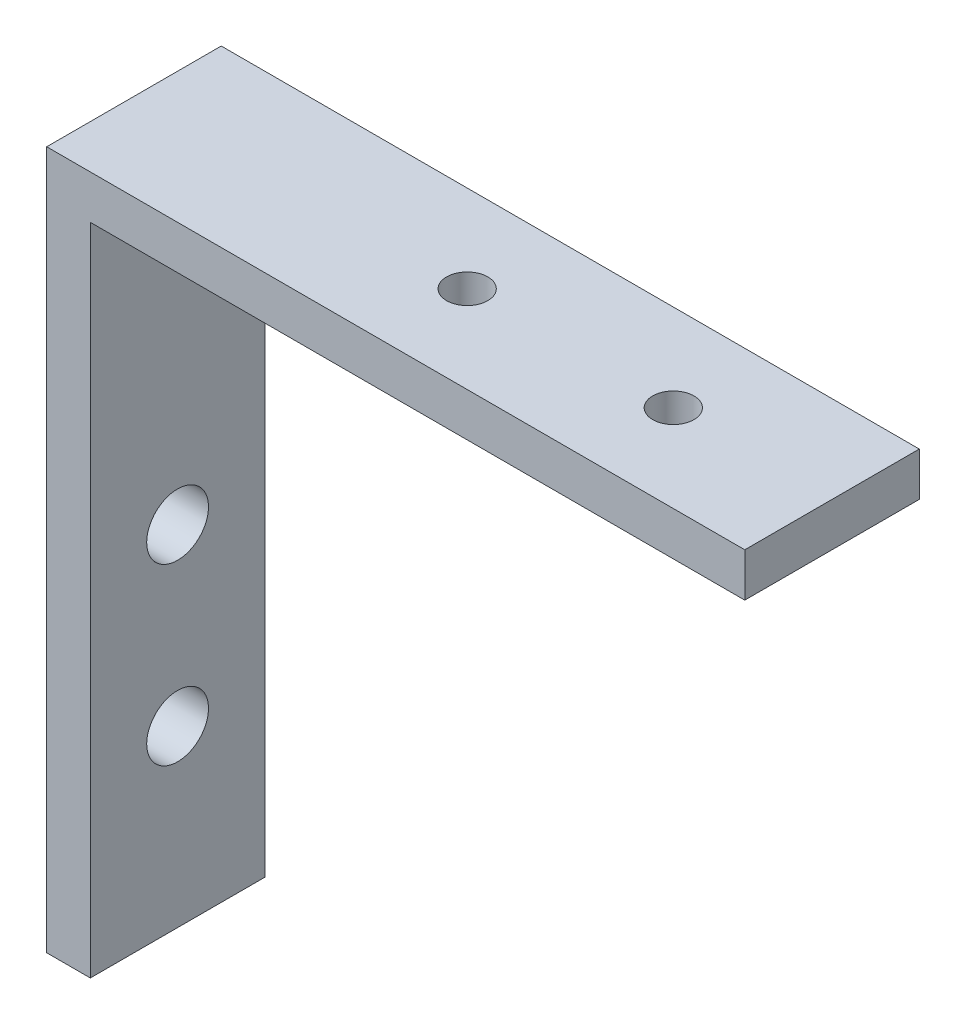
ISO-10303-21;
HEADER;
FILE_DESCRIPTION(('STEP AP214'),'2;1');
FILE_NAME('part.step','',(''),(''),'','','');
FILE_SCHEMA(('AUTOMOTIVE_DESIGN { 1 0 10303 214 1 1 1 1 }'));
ENDSEC;
DATA;
#1=APPLICATION_CONTEXT('core data for automotive mechanical design processes');
#2=APPLICATION_PROTOCOL_DEFINITION('international standard','automotive_design',2000,#1);
#3=PRODUCT_CONTEXT('',#1,'mechanical');
#4=PRODUCT('Part','Part','',(#3));
#5=PRODUCT_RELATED_PRODUCT_CATEGORY('part','',(#4));
#6=PRODUCT_DEFINITION_FORMATION('','',#4);
#7=PRODUCT_DEFINITION_CONTEXT('part definition',#1,'design');
#8=PRODUCT_DEFINITION('design','',#6,#7);
#9=PRODUCT_DEFINITION_SHAPE('','',#8);
#10=(LENGTH_UNIT() NAMED_UNIT(*) SI_UNIT(.MILLI.,.METRE.));
#11=(NAMED_UNIT(*) PLANE_ANGLE_UNIT() SI_UNIT($,.RADIAN.));
#12=(NAMED_UNIT(*) SI_UNIT($,.STERADIAN.) SOLID_ANGLE_UNIT());
#13=UNCERTAINTY_MEASURE_WITH_UNIT(LENGTH_MEASURE(1.E-05),#10,'distance_accuracy_value','');
#14=(GEOMETRIC_REPRESENTATION_CONTEXT(3) GLOBAL_UNCERTAINTY_ASSIGNED_CONTEXT((#13)) GLOBAL_UNIT_ASSIGNED_CONTEXT((#10,
#11,#12)) REPRESENTATION_CONTEXT('',''));
#15=CARTESIAN_POINT('',(0.,0.,0.));
#16=DIRECTION('',(0.,0.,1.));
#17=DIRECTION('',(1.,0.,0.));
#18=AXIS2_PLACEMENT_3D('',#15,#16,#17);
#19=CARTESIAN_POINT('',(0.,47.625,12.7));
#20=DIRECTION('',(0.,1.,0.));
#21=DIRECTION('',(0.,0.,1.));
#22=AXIS2_PLACEMENT_3D('',#19,#20,#21);
#23=PLANE('',#22);
#24=CARTESIAN_POINT('',(39.25,47.625,6.35));
#25=DIRECTION('',(0.,1.,0.));
#26=DIRECTION('',(0.,0.,1.));
#27=AXIS2_PLACEMENT_3D('',#24,#25,#26);
#28=CIRCLE('',#27,1.5);
#29=CARTESIAN_POINT('',(39.25,47.625,7.85));
#30=VERTEX_POINT('',#29);
#31=EDGE_CURVE('E161',#30,#30,#28,.F.);
#32=ORIENTED_EDGE('',*,*,#31,.F.);
#33=EDGE_LOOP('',(#32));
#34=FACE_BOUND('',#33,.T.);
#35=CARTESIAN_POINT('',(24.25,47.625,6.35));
#36=DIRECTION('',(0.,1.,0.));
#37=DIRECTION('',(0.,0.,1.));
#38=AXIS2_PLACEMENT_3D('',#35,#36,#37);
#39=CIRCLE('',#38,1.5);
#40=CARTESIAN_POINT('',(24.25,47.625,7.85));
#41=VERTEX_POINT('',#40);
#42=EDGE_CURVE('E164',#41,#41,#39,.F.);
#43=ORIENTED_EDGE('',*,*,#42,.F.);
#44=EDGE_LOOP('',(#43));
#45=FACE_BOUND('',#44,.T.);
#46=DIRECTION('',(1.,0.,0.));
#47=VECTOR('',#46,1.);
#48=CARTESIAN_POINT('',(0.,47.625,0.));
#49=LINE('',#48,#47);
#50=CARTESIAN_POINT('',(3.175,47.625,0.));
#51=VERTEX_POINT('',#50);
#52=CARTESIAN_POINT('',(50.8,47.625,0.));
#53=VERTEX_POINT('',#52);
#54=EDGE_CURVE('E113',#51,#53,#49,.T.);
#55=ORIENTED_EDGE('',*,*,#54,.T.);
#56=DIRECTION('',(0.,0.,-1.));
#57=VECTOR('',#56,1.);
#58=CARTESIAN_POINT('',(50.8,47.625,12.7));
#59=LINE('',#58,#57);
#60=CARTESIAN_POINT('',(50.8,47.625,12.7));
#61=VERTEX_POINT('',#60);
#62=EDGE_CURVE('E11',#61,#53,#59,.T.);
#63=ORIENTED_EDGE('',*,*,#62,.F.);
#64=DIRECTION('',(1.,0.,0.));
#65=VECTOR('',#64,1.);
#66=CARTESIAN_POINT('',(0.,47.625,12.7));
#67=LINE('',#66,#65);
#68=CARTESIAN_POINT('',(3.175,47.625,12.7));
#69=VERTEX_POINT('',#68);
#70=EDGE_CURVE('E78',#69,#61,#67,.T.);
#71=ORIENTED_EDGE('',*,*,#70,.F.);
#72=DIRECTION('',(0.,0.,-1.));
#73=VECTOR('',#72,1.);
#74=CARTESIAN_POINT('',(3.175,47.625,12.7));
#75=LINE('',#74,#73);
#76=EDGE_CURVE('E109',#69,#51,#75,.T.);
#77=ORIENTED_EDGE('',*,*,#76,.T.);
#78=EDGE_LOOP('',(#55,#63,#71,#77));
#79=FACE_BOUND('',#78,.T.);
#80=ADVANCED_FACE('F32',(#34,#45,#79),#23,.F.);
#81=CARTESIAN_POINT('',(50.8,50.8,12.7));
#82=DIRECTION('',(1.,0.,0.));
#83=DIRECTION('',(0.,0.,-1.));
#84=AXIS2_PLACEMENT_3D('',#81,#82,#83);
#85=PLANE('',#84);
#86=DIRECTION('',(0.,-1.,0.));
#87=VECTOR('',#86,1.);
#88=CARTESIAN_POINT('',(50.8,50.8,0.));
#89=LINE('',#88,#87);
#90=CARTESIAN_POINT('',(50.8,50.8,0.));
#91=VERTEX_POINT('',#90);
#92=EDGE_CURVE('E116',#91,#53,#89,.T.);
#93=ORIENTED_EDGE('',*,*,#92,.F.);
#94=DIRECTION('',(0.,0.,-1.));
#95=VECTOR('',#94,1.);
#96=CARTESIAN_POINT('',(50.8,50.8,12.7));
#97=LINE('',#96,#95);
#98=CARTESIAN_POINT('',(50.8,50.8,12.7));
#99=VERTEX_POINT('',#98);
#100=EDGE_CURVE('E40',#99,#91,#97,.T.);
#101=ORIENTED_EDGE('',*,*,#100,.F.);
#102=DIRECTION('',(0.,-1.,0.));
#103=VECTOR('',#102,1.);
#104=CARTESIAN_POINT('',(50.8,50.8,12.7));
#105=LINE('',#104,#103);
#106=EDGE_CURVE('E184',#99,#61,#105,.T.);
#107=ORIENTED_EDGE('',*,*,#106,.T.);
#108=ORIENTED_EDGE('',*,*,#62,.T.);
#109=EDGE_LOOP('',(#93,#101,#107,#108));
#110=FACE_BOUND('',#109,.T.);
#111=ADVANCED_FACE('F135',(#110),#85,.T.);
#112=CARTESIAN_POINT('',(0.,50.8,12.7));
#113=DIRECTION('',(0.,1.,0.));
#114=DIRECTION('',(0.,0.,1.));
#115=AXIS2_PLACEMENT_3D('',#112,#113,#114);
#116=PLANE('',#115);
#117=CARTESIAN_POINT('',(39.25,50.8,6.35));
#118=DIRECTION('',(0.,1.,0.));
#119=DIRECTION('',(0.,0.,1.));
#120=AXIS2_PLACEMENT_3D('',#117,#118,#119);
#121=CIRCLE('',#120,1.5);
#122=CARTESIAN_POINT('',(39.25,50.8,7.85));
#123=VERTEX_POINT('',#122);
#124=EDGE_CURVE('E211',#123,#123,#121,.T.);
#125=ORIENTED_EDGE('',*,*,#124,.F.);
#126=EDGE_LOOP('',(#125));
#127=FACE_BOUND('',#126,.T.);
#128=CARTESIAN_POINT('',(24.25,50.8,6.35));
#129=DIRECTION('',(0.,1.,0.));
#130=DIRECTION('',(0.,0.,1.));
#131=AXIS2_PLACEMENT_3D('',#128,#129,#130);
#132=CIRCLE('',#131,1.5);
#133=CARTESIAN_POINT('',(24.25,50.8,7.85));
#134=VERTEX_POINT('',#133);
#135=EDGE_CURVE('E167',#134,#134,#132,.T.);
#136=ORIENTED_EDGE('',*,*,#135,.F.);
#137=EDGE_LOOP('',(#136));
#138=FACE_BOUND('',#137,.T.);
#139=DIRECTION('',(1.,0.,0.));
#140=VECTOR('',#139,1.);
#141=CARTESIAN_POINT('',(0.,50.8,0.));
#142=LINE('',#141,#140);
#143=CARTESIAN_POINT('',(0.,50.8,0.));
#144=VERTEX_POINT('',#143);
#145=EDGE_CURVE('E120',#144,#91,#142,.T.);
#146=ORIENTED_EDGE('',*,*,#145,.F.);
#147=DIRECTION('',(0.,0.,-1.));
#148=VECTOR('',#147,1.);
#149=CARTESIAN_POINT('',(0.,50.8,12.7));
#150=LINE('',#149,#148);
#151=CARTESIAN_POINT('',(0.,50.8,12.7));
#152=VERTEX_POINT('',#151);
#153=EDGE_CURVE('E99',#152,#144,#150,.T.);
#154=ORIENTED_EDGE('',*,*,#153,.F.);
#155=DIRECTION('',(1.,0.,0.));
#156=VECTOR('',#155,1.);
#157=CARTESIAN_POINT('',(0.,50.8,12.7));
#158=LINE('',#157,#156);
#159=EDGE_CURVE('E105',#152,#99,#158,.T.);
#160=ORIENTED_EDGE('',*,*,#159,.T.);
#161=ORIENTED_EDGE('',*,*,#100,.T.);
#162=EDGE_LOOP('',(#146,#154,#160,#161));
#163=FACE_BOUND('',#162,.T.);
#164=ADVANCED_FACE('F132',(#127,#138,#163),#116,.T.);
#165=CARTESIAN_POINT('',(0.,0.,12.7));
#166=DIRECTION('',(-1.,0.,0.));
#167=DIRECTION('',(0.,0.,1.));
#168=AXIS2_PLACEMENT_3D('',#165,#166,#167);
#169=PLANE('',#168);
#170=CARTESIAN_POINT('',(0.,25.4,6.35000000000027));
#171=DIRECTION('',(-1.,0.,0.));
#172=DIRECTION('',(0.,0.,1.));
#173=AXIS2_PLACEMENT_3D('',#170,#171,#172);
#174=CIRCLE('',#173,2.25);
#175=CARTESIAN_POINT('',(0.,25.4,8.60000000000027));
#176=VERTEX_POINT('',#175);
#177=EDGE_CURVE('E166',#176,#176,#174,.T.);
#178=ORIENTED_EDGE('',*,*,#177,.F.);
#179=EDGE_LOOP('',(#178));
#180=FACE_BOUND('',#179,.T.);
#181=CARTESIAN_POINT('',(0.,12.7,6.3500000000004));
#182=DIRECTION('',(-1.,0.,0.));
#183=DIRECTION('',(0.,0.,1.));
#184=AXIS2_PLACEMENT_3D('',#181,#182,#183);
#185=CIRCLE('',#184,2.25);
#186=CARTESIAN_POINT('',(0.,12.7,8.6000000000004));
#187=VERTEX_POINT('',#186);
#188=EDGE_CURVE('E178',#187,#187,#185,.T.);
#189=ORIENTED_EDGE('',*,*,#188,.F.);
#190=EDGE_LOOP('',(#189));
#191=FACE_BOUND('',#190,.T.);
#192=DIRECTION('',(0.,1.,0.));
#193=VECTOR('',#192,1.);
#194=CARTESIAN_POINT('',(0.,0.,0.));
#195=LINE('',#194,#193);
#196=CARTESIAN_POINT('',(0.,0.,0.));
#197=VERTEX_POINT('',#196);
#198=EDGE_CURVE('E94',#197,#144,#195,.T.);
#199=ORIENTED_EDGE('',*,*,#198,.F.);
#200=DIRECTION('',(0.,0.,-1.));
#201=VECTOR('',#200,1.);
#202=CARTESIAN_POINT('',(0.,0.,12.7));
#203=LINE('',#202,#201);
#204=CARTESIAN_POINT('',(0.,0.,12.7));
#205=VERTEX_POINT('',#204);
#206=EDGE_CURVE('E89',#205,#197,#203,.T.);
#207=ORIENTED_EDGE('',*,*,#206,.F.);
#208=DIRECTION('',(0.,1.,0.));
#209=VECTOR('',#208,1.);
#210=CARTESIAN_POINT('',(0.,0.,12.7));
#211=LINE('',#210,#209);
#212=EDGE_CURVE('E92',#205,#152,#211,.T.);
#213=ORIENTED_EDGE('',*,*,#212,.T.);
#214=ORIENTED_EDGE('',*,*,#153,.T.);
#215=EDGE_LOOP('',(#199,#207,#213,#214));
#216=FACE_BOUND('',#215,.T.);
#217=ADVANCED_FACE('F91',(#180,#191,#216),#169,.T.);
#218=CARTESIAN_POINT('',(3.175,0.,12.7));
#219=DIRECTION('',(0.,-1.,0.));
#220=DIRECTION('',(0.,0.,-1.));
#221=AXIS2_PLACEMENT_3D('',#218,#219,#220);
#222=PLANE('',#221);
#223=DIRECTION('',(-1.,0.,0.));
#224=VECTOR('',#223,1.);
#225=CARTESIAN_POINT('',(3.175,0.,0.));
#226=LINE('',#225,#224);
#227=CARTESIAN_POINT('',(3.175,0.,0.));
#228=VERTEX_POINT('',#227);
#229=EDGE_CURVE('E124',#228,#197,#226,.T.);
#230=ORIENTED_EDGE('',*,*,#229,.F.);
#231=DIRECTION('',(0.,0.,-1.));
#232=VECTOR('',#231,1.);
#233=CARTESIAN_POINT('',(3.175,0.,12.7));
#234=LINE('',#233,#232);
#235=CARTESIAN_POINT('',(3.175,0.,12.7));
#236=VERTEX_POINT('',#235);
#237=EDGE_CURVE('E69',#236,#228,#234,.T.);
#238=ORIENTED_EDGE('',*,*,#237,.F.);
#239=DIRECTION('',(-1.,0.,0.));
#240=VECTOR('',#239,1.);
#241=CARTESIAN_POINT('',(3.175,0.,12.7));
#242=LINE('',#241,#240);
#243=EDGE_CURVE('E103',#236,#205,#242,.T.);
#244=ORIENTED_EDGE('',*,*,#243,.T.);
#245=ORIENTED_EDGE('',*,*,#206,.T.);
#246=EDGE_LOOP('',(#230,#238,#244,#245));
#247=FACE_BOUND('',#246,.T.);
#248=ADVANCED_FACE('F107',(#247),#222,.T.);
#249=CARTESIAN_POINT('',(3.175,0.,12.7));
#250=DIRECTION('',(-1.,0.,0.));
#251=DIRECTION('',(0.,0.,1.));
#252=AXIS2_PLACEMENT_3D('',#249,#250,#251);
#253=PLANE('',#252);
#254=CARTESIAN_POINT('',(3.175,25.4,6.35000000000027));
#255=DIRECTION('',(-1.,0.,0.));
#256=DIRECTION('',(0.,0.,1.));
#257=AXIS2_PLACEMENT_3D('',#254,#255,#256);
#258=CIRCLE('',#257,2.25);
#259=CARTESIAN_POINT('',(3.175,25.4,8.60000000000027));
#260=VERTEX_POINT('',#259);
#261=EDGE_CURVE('E170',#260,#260,#258,.F.);
#262=ORIENTED_EDGE('',*,*,#261,.F.);
#263=EDGE_LOOP('',(#262));
#264=FACE_BOUND('',#263,.T.);
#265=CARTESIAN_POINT('',(3.175,12.7,6.3500000000004));
#266=DIRECTION('',(-1.,0.,0.));
#267=DIRECTION('',(0.,0.,1.));
#268=AXIS2_PLACEMENT_3D('',#265,#266,#267);
#269=CIRCLE('',#268,2.25);
#270=CARTESIAN_POINT('',(3.175,12.7,8.6000000000004));
#271=VERTEX_POINT('',#270);
#272=EDGE_CURVE('E117',#271,#271,#269,.F.);
#273=ORIENTED_EDGE('',*,*,#272,.F.);
#274=EDGE_LOOP('',(#273));
#275=FACE_BOUND('',#274,.T.);
#276=DIRECTION('',(0.,1.,0.));
#277=VECTOR('',#276,1.);
#278=CARTESIAN_POINT('',(3.175,0.,0.));
#279=LINE('',#278,#277);
#280=EDGE_CURVE('E72',#228,#51,#279,.T.);
#281=ORIENTED_EDGE('',*,*,#280,.T.);
#282=ORIENTED_EDGE('',*,*,#76,.F.);
#283=DIRECTION('',(0.,1.,0.));
#284=VECTOR('',#283,1.);
#285=CARTESIAN_POINT('',(3.175,0.,12.7));
#286=LINE('',#285,#284);
#287=EDGE_CURVE('E48',#236,#69,#286,.T.);
#288=ORIENTED_EDGE('',*,*,#287,.F.);
#289=ORIENTED_EDGE('',*,*,#237,.T.);
#290=EDGE_LOOP('',(#281,#282,#288,#289));
#291=FACE_BOUND('',#290,.T.);
#292=ADVANCED_FACE('F140',(#264,#275,#291),#253,.F.);
#293=CARTESIAN_POINT('',(0.,0.,12.7));
#294=DIRECTION('',(0.,0.,-1.));
#295=DIRECTION('',(-1.,0.,0.));
#296=AXIS2_PLACEMENT_3D('',#293,#294,#295);
#297=PLANE('',#296);
#298=ORIENTED_EDGE('',*,*,#70,.T.);
#299=ORIENTED_EDGE('',*,*,#106,.F.);
#300=ORIENTED_EDGE('',*,*,#159,.F.);
#301=ORIENTED_EDGE('',*,*,#212,.F.);
#302=ORIENTED_EDGE('',*,*,#243,.F.);
#303=ORIENTED_EDGE('',*,*,#287,.T.);
#304=EDGE_LOOP('',(#298,#299,#300,#301,#302,#303));
#305=FACE_BOUND('',#304,.T.);
#306=ADVANCED_FACE('F102',(#305),#297,.F.);
#307=CARTESIAN_POINT('',(0.,0.,0.));
#308=DIRECTION('',(0.,0.,-1.));
#309=DIRECTION('',(-1.,0.,0.));
#310=AXIS2_PLACEMENT_3D('',#307,#308,#309);
#311=PLANE('',#310);
#312=ORIENTED_EDGE('',*,*,#54,.F.);
#313=ORIENTED_EDGE('',*,*,#280,.F.);
#314=ORIENTED_EDGE('',*,*,#229,.T.);
#315=ORIENTED_EDGE('',*,*,#198,.T.);
#316=ORIENTED_EDGE('',*,*,#145,.T.);
#317=ORIENTED_EDGE('',*,*,#92,.T.);
#318=EDGE_LOOP('',(#312,#313,#314,#315,#316,#317));
#319=FACE_BOUND('',#318,.T.);
#320=ADVANCED_FACE('F138',(#319),#311,.T.);
#321=CARTESIAN_POINT('',(50.801,12.7,6.3500000000004));
#322=DIRECTION('',(-1.,0.,0.));
#323=DIRECTION('',(0.,0.,1.));
#324=AXIS2_PLACEMENT_3D('',#321,#322,#323);
#325=CYLINDRICAL_SURFACE('',#324,2.25);
#326=ORIENTED_EDGE('',*,*,#188,.T.);
#327=EDGE_LOOP('',(#326));
#328=FACE_BOUND('',#327,.T.);
#329=ORIENTED_EDGE('',*,*,#272,.T.);
#330=EDGE_LOOP('',(#329));
#331=FACE_BOUND('',#330,.T.);
#332=ADVANCED_FACE('F187',(#328,#331),#325,.F.);
#333=CARTESIAN_POINT('',(50.801,25.4,6.35000000000027));
#334=DIRECTION('',(-1.,0.,0.));
#335=DIRECTION('',(0.,0.,1.));
#336=AXIS2_PLACEMENT_3D('',#333,#334,#335);
#337=CYLINDRICAL_SURFACE('',#336,2.25);
#338=ORIENTED_EDGE('',*,*,#177,.T.);
#339=EDGE_LOOP('',(#338));
#340=FACE_BOUND('',#339,.T.);
#341=ORIENTED_EDGE('',*,*,#261,.T.);
#342=EDGE_LOOP('',(#341));
#343=FACE_BOUND('',#342,.T.);
#344=ADVANCED_FACE('F189',(#340,#343),#337,.F.);
#345=CARTESIAN_POINT('',(24.25,-0.001000000000001,6.35));
#346=DIRECTION('',(0.,1.,0.));
#347=DIRECTION('',(0.,0.,1.));
#348=AXIS2_PLACEMENT_3D('',#345,#346,#347);
#349=CYLINDRICAL_SURFACE('',#348,1.5);
#350=ORIENTED_EDGE('',*,*,#135,.T.);
#351=EDGE_LOOP('',(#350));
#352=FACE_BOUND('',#351,.T.);
#353=ORIENTED_EDGE('',*,*,#42,.T.);
#354=EDGE_LOOP('',(#353));
#355=FACE_BOUND('',#354,.T.);
#356=ADVANCED_FACE('F196',(#352,#355),#349,.F.);
#357=CARTESIAN_POINT('',(39.25,-0.001000000000001,6.35));
#358=DIRECTION('',(0.,1.,0.));
#359=DIRECTION('',(0.,0.,1.));
#360=AXIS2_PLACEMENT_3D('',#357,#358,#359);
#361=CYLINDRICAL_SURFACE('',#360,1.5);
#362=ORIENTED_EDGE('',*,*,#124,.T.);
#363=EDGE_LOOP('',(#362));
#364=FACE_BOUND('',#363,.T.);
#365=ORIENTED_EDGE('',*,*,#31,.T.);
#366=EDGE_LOOP('',(#365));
#367=FACE_BOUND('',#366,.T.);
#368=ADVANCED_FACE('F202',(#364,#367),#361,.F.);
#369=CLOSED_SHELL('',(#80,#111,#164,#217,#248,#292,#306,#320,#332,#344,#356,#368));
#370=MANIFOLD_SOLID_BREP('B2',#369);
#371=ADVANCED_BREP_SHAPE_REPRESENTATION('',(#18,#370),#14);
#372=SHAPE_DEFINITION_REPRESENTATION(#9,#371);
ENDSEC;
END-ISO-10303-21;
